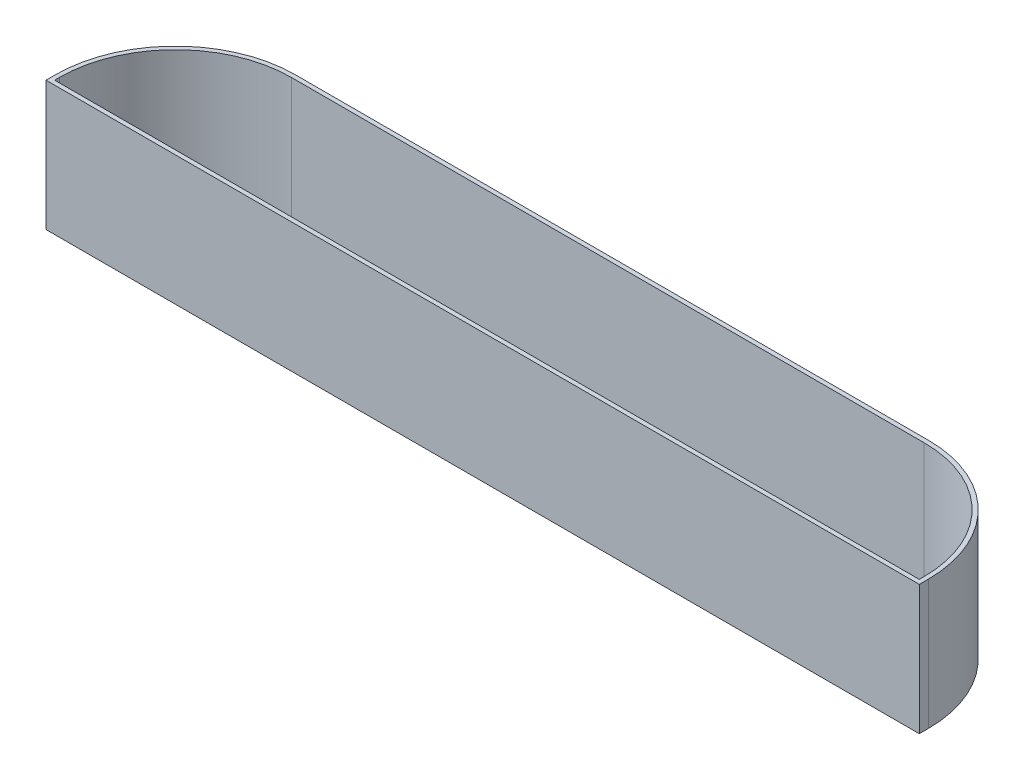
ISO-10303-21;
HEADER;
FILE_DESCRIPTION(('STEP AP214'),'2;1');
FILE_NAME('part.step','',(''),(''),'','','');
FILE_SCHEMA(('AUTOMOTIVE_DESIGN { 1 0 10303 214 1 1 1 1 }'));
ENDSEC;
DATA;
#1=APPLICATION_CONTEXT('core data for automotive mechanical design processes');
#2=APPLICATION_PROTOCOL_DEFINITION('international standard','automotive_design',2000,#1);
#3=PRODUCT_CONTEXT('',#1,'mechanical');
#4=PRODUCT('Part','Part','',(#3));
#5=PRODUCT_RELATED_PRODUCT_CATEGORY('part','',(#4));
#6=PRODUCT_DEFINITION_FORMATION('','',#4);
#7=PRODUCT_DEFINITION_CONTEXT('part definition',#1,'design');
#8=PRODUCT_DEFINITION('design','',#6,#7);
#9=PRODUCT_DEFINITION_SHAPE('','',#8);
#10=(LENGTH_UNIT() NAMED_UNIT(*) SI_UNIT(.MILLI.,.METRE.));
#11=(NAMED_UNIT(*) PLANE_ANGLE_UNIT() SI_UNIT($,.RADIAN.));
#12=(NAMED_UNIT(*) SI_UNIT($,.STERADIAN.) SOLID_ANGLE_UNIT());
#13=UNCERTAINTY_MEASURE_WITH_UNIT(LENGTH_MEASURE(1.E-05),#10,'distance_accuracy_value','');
#14=(GEOMETRIC_REPRESENTATION_CONTEXT(3) GLOBAL_UNCERTAINTY_ASSIGNED_CONTEXT((#13)) GLOBAL_UNIT_ASSIGNED_CONTEXT((#10,
#11,#12)) REPRESENTATION_CONTEXT('',''));
#15=CARTESIAN_POINT('',(0.,0.,0.));
#16=DIRECTION('',(0.,0.,1.));
#17=DIRECTION('',(1.,0.,0.));
#18=AXIS2_PLACEMENT_3D('',#15,#16,#17);
#19=CARTESIAN_POINT('',(-186.375,76.2,-5.40000000000002));
#20=DIRECTION('',(0.,-1.,0.));
#21=DIRECTION('',(0.,0.,-1.));
#22=AXIS2_PLACEMENT_3D('',#19,#20,#21);
#23=PLANE('',#22);
#24=DIRECTION('',(0.,0.,1.));
#25=VECTOR('',#24,1.);
#26=CARTESIAN_POINT('',(-257.175,76.2,0.));
#27=LINE('',#26,#25);
#28=CARTESIAN_POINT('',(-257.175,76.2,-5.3999999999995));
#29=VERTEX_POINT('',#28);
#30=CARTESIAN_POINT('',(-257.175,76.2,0.));
#31=VERTEX_POINT('',#30);
#32=EDGE_CURVE('E181',#29,#31,#27,.T.);
#33=ORIENTED_EDGE('',*,*,#32,.T.);
#34=DIRECTION('',(1.,0.,0.));
#35=VECTOR('',#34,1.);
#36=CARTESIAN_POINT('',(-257.175,76.2,0.));
#37=LINE('',#36,#35);
#38=CARTESIAN_POINT('',(257.175,76.2,0.));
#39=VERTEX_POINT('',#38);
#40=EDGE_CURVE('E184',#31,#39,#37,.T.);
#41=ORIENTED_EDGE('',*,*,#40,.T.);
#42=DIRECTION('',(0.,0.,-1.));
#43=VECTOR('',#42,1.);
#44=CARTESIAN_POINT('',(257.175,76.2,-5.3999999999996));
#45=LINE('',#44,#43);
#46=CARTESIAN_POINT('',(257.175,76.2,-5.3999999999996));
#47=VERTEX_POINT('',#46);
#48=EDGE_CURVE('E187',#39,#47,#45,.T.);
#49=ORIENTED_EDGE('',*,*,#48,.T.);
#50=CARTESIAN_POINT('',(186.375,76.2,-5.4000000000001));
#51=DIRECTION('',(0.,1.,0.));
#52=DIRECTION('',(0.,0.,-1.));
#53=AXIS2_PLACEMENT_3D('',#50,#51,#52);
#54=CIRCLE('',#53,70.8);
#55=CARTESIAN_POINT('',(186.374999999999,76.2,-76.2000000000001));
#56=VERTEX_POINT('',#55);
#57=EDGE_CURVE('E189',#47,#56,#54,.T.);
#58=ORIENTED_EDGE('',*,*,#57,.T.);
#59=DIRECTION('',(-1.,0.,0.));
#60=VECTOR('',#59,1.);
#61=CARTESIAN_POINT('',(-186.375,76.2,-76.2));
#62=LINE('',#61,#60);
#63=CARTESIAN_POINT('',(-186.375,76.2,-76.2));
#64=VERTEX_POINT('',#63);
#65=EDGE_CURVE('E191',#56,#64,#62,.T.);
#66=ORIENTED_EDGE('',*,*,#65,.T.);
#67=CARTESIAN_POINT('',(-186.375,76.2,-5.40000000000002));
#68=DIRECTION('',(0.,1.,0.));
#69=DIRECTION('',(0.,0.,-1.));
#70=AXIS2_PLACEMENT_3D('',#67,#68,#69);
#71=CIRCLE('',#70,70.8);
#72=EDGE_CURVE('E193',#64,#29,#71,.T.);
#73=ORIENTED_EDGE('',*,*,#72,.T.);
#74=EDGE_LOOP('',(#33,#41,#49,#58,#66,#73));
#75=FACE_BOUND('',#74,.T.);
#76=CARTESIAN_POINT('',(186.375,76.2,-5.4000000000001));
#77=DIRECTION('',(0.,1.,0.));
#78=DIRECTION('',(0.,0.,-1.));
#79=AXIS2_PLACEMENT_3D('',#76,#77,#78);
#80=CIRCLE('',#79,68.26);
#81=CARTESIAN_POINT('',(254.635,76.2,-5.40000000000008));
#82=VERTEX_POINT('',#81);
#83=CARTESIAN_POINT('',(186.375,76.2,-73.66));
#84=VERTEX_POINT('',#83);
#85=EDGE_CURVE('E130',#82,#84,#80,.T.);
#86=ORIENTED_EDGE('',*,*,#85,.F.);
#87=DIRECTION('',(0.,0.,-1.));
#88=VECTOR('',#87,1.);
#89=CARTESIAN_POINT('',(254.635,76.2,-5.40000000000008));
#90=LINE('',#89,#88);
#91=CARTESIAN_POINT('',(254.635,76.2,-2.54));
#92=VERTEX_POINT('',#91);
#93=EDGE_CURVE('E159',#92,#82,#90,.T.);
#94=ORIENTED_EDGE('',*,*,#93,.F.);
#95=DIRECTION('',(1.,0.,0.));
#96=VECTOR('',#95,1.);
#97=CARTESIAN_POINT('',(-254.635,76.2,-2.54));
#98=LINE('',#97,#96);
#99=CARTESIAN_POINT('',(-254.635,76.2,-2.54));
#100=VERTEX_POINT('',#99);
#101=EDGE_CURVE('E157',#100,#92,#98,.T.);
#102=ORIENTED_EDGE('',*,*,#101,.F.);
#103=DIRECTION('',(0.,0.,1.));
#104=VECTOR('',#103,1.);
#105=CARTESIAN_POINT('',(-254.635,76.2,-2.54));
#106=LINE('',#105,#104);
#107=CARTESIAN_POINT('',(-254.635,76.2,-5.39999999999998));
#108=VERTEX_POINT('',#107);
#109=EDGE_CURVE('E153',#108,#100,#106,.T.);
#110=ORIENTED_EDGE('',*,*,#109,.F.);
#111=CARTESIAN_POINT('',(-186.375,76.2,-5.40000000000002));
#112=DIRECTION('',(0.,1.,0.));
#113=DIRECTION('',(0.,0.,-1.));
#114=AXIS2_PLACEMENT_3D('',#111,#112,#113);
#115=CIRCLE('',#114,68.26);
#116=CARTESIAN_POINT('',(-186.375,76.2,-73.66));
#117=VERTEX_POINT('',#116);
#118=EDGE_CURVE('E151',#117,#108,#115,.T.);
#119=ORIENTED_EDGE('',*,*,#118,.F.);
#120=DIRECTION('',(-1.,0.,0.));
#121=VECTOR('',#120,1.);
#122=CARTESIAN_POINT('',(-186.375,76.2,-73.66));
#123=LINE('',#122,#121);
#124=EDGE_CURVE('E138',#84,#117,#123,.T.);
#125=ORIENTED_EDGE('',*,*,#124,.F.);
#126=EDGE_LOOP('',(#86,#94,#102,#110,#119,#125));
#127=FACE_BOUND('',#126,.T.);
#128=ADVANCED_FACE('F41',(#75,#127),#23,.F.);
#129=CARTESIAN_POINT('',(-186.375,0.,-5.40000000000002));
#130=DIRECTION('',(0.,-1.,0.));
#131=DIRECTION('',(0.,0.,-1.));
#132=AXIS2_PLACEMENT_3D('',#129,#130,#131);
#133=PLANE('',#132);
#134=DIRECTION('',(0.,0.,1.));
#135=VECTOR('',#134,1.);
#136=CARTESIAN_POINT('',(-257.175,0.,0.));
#137=LINE('',#136,#135);
#138=CARTESIAN_POINT('',(-257.175,0.,-5.3999999999995));
#139=VERTEX_POINT('',#138);
#140=CARTESIAN_POINT('',(-257.175,0.,0.));
#141=VERTEX_POINT('',#140);
#142=EDGE_CURVE('E146',#139,#141,#137,.T.);
#143=ORIENTED_EDGE('',*,*,#142,.F.);
#144=CARTESIAN_POINT('',(-186.375,0.,-5.40000000000002));
#145=DIRECTION('',(0.,1.,0.));
#146=DIRECTION('',(0.,0.,-1.));
#147=AXIS2_PLACEMENT_3D('',#144,#145,#146);
#148=CIRCLE('',#147,70.8);
#149=CARTESIAN_POINT('',(-186.375,0.,-76.2));
#150=VERTEX_POINT('',#149);
#151=EDGE_CURVE('E185',#150,#139,#148,.T.);
#152=ORIENTED_EDGE('',*,*,#151,.F.);
#153=DIRECTION('',(-1.,0.,0.));
#154=VECTOR('',#153,1.);
#155=CARTESIAN_POINT('',(-186.375,0.,-76.2));
#156=LINE('',#155,#154);
#157=CARTESIAN_POINT('',(186.374999999999,0.,-76.2000000000001));
#158=VERTEX_POINT('',#157);
#159=EDGE_CURVE('E204',#158,#150,#156,.T.);
#160=ORIENTED_EDGE('',*,*,#159,.F.);
#161=CARTESIAN_POINT('',(186.375,0.,-5.4000000000001));
#162=DIRECTION('',(0.,1.,0.));
#163=DIRECTION('',(0.,0.,-1.));
#164=AXIS2_PLACEMENT_3D('',#161,#162,#163);
#165=CIRCLE('',#164,70.8);
#166=CARTESIAN_POINT('',(257.175,0.,-5.3999999999996));
#167=VERTEX_POINT('',#166);
#168=EDGE_CURVE('E202',#167,#158,#165,.T.);
#169=ORIENTED_EDGE('',*,*,#168,.F.);
#170=DIRECTION('',(0.,0.,-1.));
#171=VECTOR('',#170,1.);
#172=CARTESIAN_POINT('',(257.175,0.,-5.3999999999996));
#173=LINE('',#172,#171);
#174=CARTESIAN_POINT('',(257.175,0.,0.));
#175=VERTEX_POINT('',#174);
#176=EDGE_CURVE('E200',#175,#167,#173,.T.);
#177=ORIENTED_EDGE('',*,*,#176,.F.);
#178=DIRECTION('',(1.,0.,0.));
#179=VECTOR('',#178,1.);
#180=CARTESIAN_POINT('',(-257.175,0.,0.));
#181=LINE('',#180,#179);
#182=EDGE_CURVE('E198',#141,#175,#181,.T.);
#183=ORIENTED_EDGE('',*,*,#182,.F.);
#184=EDGE_LOOP('',(#143,#152,#160,#169,#177,#183));
#185=FACE_BOUND('',#184,.T.);
#186=DIRECTION('',(0.,0.,-1.));
#187=VECTOR('',#186,1.);
#188=CARTESIAN_POINT('',(254.635,0.,-5.40000000000008));
#189=LINE('',#188,#187);
#190=CARTESIAN_POINT('',(254.635,0.,-2.54));
#191=VERTEX_POINT('',#190);
#192=CARTESIAN_POINT('',(254.635,0.,-5.40000000000008));
#193=VERTEX_POINT('',#192);
#194=EDGE_CURVE('E139',#191,#193,#189,.T.);
#195=ORIENTED_EDGE('',*,*,#194,.T.);
#196=CARTESIAN_POINT('',(186.375,0.,-5.4000000000001));
#197=DIRECTION('',(0.,1.,0.));
#198=DIRECTION('',(0.,0.,-1.));
#199=AXIS2_PLACEMENT_3D('',#196,#197,#198);
#200=CIRCLE('',#199,68.26);
#201=CARTESIAN_POINT('',(186.375,0.,-73.66));
#202=VERTEX_POINT('',#201);
#203=EDGE_CURVE('E64',#193,#202,#200,.T.);
#204=ORIENTED_EDGE('',*,*,#203,.T.);
#205=DIRECTION('',(-1.,0.,0.));
#206=VECTOR('',#205,1.);
#207=CARTESIAN_POINT('',(-186.375,0.,-73.66));
#208=LINE('',#207,#206);
#209=CARTESIAN_POINT('',(-186.375,0.,-73.66));
#210=VERTEX_POINT('',#209);
#211=EDGE_CURVE('E145',#202,#210,#208,.T.);
#212=ORIENTED_EDGE('',*,*,#211,.T.);
#213=CARTESIAN_POINT('',(-186.375,0.,-5.40000000000002));
#214=DIRECTION('',(0.,1.,0.));
#215=DIRECTION('',(0.,0.,-1.));
#216=AXIS2_PLACEMENT_3D('',#213,#214,#215);
#217=CIRCLE('',#216,68.26);
#218=CARTESIAN_POINT('',(-254.635,0.,-5.39999999999998));
#219=VERTEX_POINT('',#218);
#220=EDGE_CURVE('E163',#210,#219,#217,.T.);
#221=ORIENTED_EDGE('',*,*,#220,.T.);
#222=DIRECTION('',(0.,0.,1.));
#223=VECTOR('',#222,1.);
#224=CARTESIAN_POINT('',(-254.635,0.,-2.54));
#225=LINE('',#224,#223);
#226=CARTESIAN_POINT('',(-254.635,0.,-2.54));
#227=VERTEX_POINT('',#226);
#228=EDGE_CURVE('E166',#219,#227,#225,.T.);
#229=ORIENTED_EDGE('',*,*,#228,.T.);
#230=DIRECTION('',(1.,0.,0.));
#231=VECTOR('',#230,1.);
#232=CARTESIAN_POINT('',(-254.635,0.,-2.54));
#233=LINE('',#232,#231);
#234=EDGE_CURVE('E169',#227,#191,#233,.T.);
#235=ORIENTED_EDGE('',*,*,#234,.T.);
#236=EDGE_LOOP('',(#195,#204,#212,#221,#229,#235));
#237=FACE_BOUND('',#236,.T.);
#238=ADVANCED_FACE('F228',(#185,#237),#133,.T.);
#239=CARTESIAN_POINT('',(-257.175,76.2,0.));
#240=DIRECTION('',(1.,0.,0.));
#241=DIRECTION('',(0.,0.,-1.));
#242=AXIS2_PLACEMENT_3D('',#239,#240,#241);
#243=PLANE('',#242);
#244=ORIENTED_EDGE('',*,*,#142,.T.);
#245=DIRECTION('',(0.,-1.,0.));
#246=VECTOR('',#245,1.);
#247=CARTESIAN_POINT('',(-257.175,76.2,0.));
#248=LINE('',#247,#246);
#249=EDGE_CURVE('E11',#31,#141,#248,.T.);
#250=ORIENTED_EDGE('',*,*,#249,.F.);
#251=ORIENTED_EDGE('',*,*,#32,.F.);
#252=DIRECTION('',(0.,-1.,0.));
#253=VECTOR('',#252,1.);
#254=CARTESIAN_POINT('',(-257.175,76.2,-5.3999999999995));
#255=LINE('',#254,#253);
#256=EDGE_CURVE('E195',#29,#139,#255,.T.);
#257=ORIENTED_EDGE('',*,*,#256,.T.);
#258=EDGE_LOOP('',(#244,#250,#251,#257));
#259=FACE_BOUND('',#258,.T.);
#260=ADVANCED_FACE('F43',(#259),#243,.F.);
#261=CARTESIAN_POINT('',(-257.175,76.2,0.));
#262=DIRECTION('',(0.,0.,-1.));
#263=DIRECTION('',(-1.,0.,0.));
#264=AXIS2_PLACEMENT_3D('',#261,#262,#263);
#265=PLANE('',#264);
#266=ORIENTED_EDGE('',*,*,#182,.T.);
#267=DIRECTION('',(0.,-1.,0.));
#268=VECTOR('',#267,1.);
#269=CARTESIAN_POINT('',(257.175,76.2,0.));
#270=LINE('',#269,#268);
#271=EDGE_CURVE('E49',#39,#175,#270,.T.);
#272=ORIENTED_EDGE('',*,*,#271,.F.);
#273=ORIENTED_EDGE('',*,*,#40,.F.);
#274=ORIENTED_EDGE('',*,*,#249,.T.);
#275=EDGE_LOOP('',(#266,#272,#273,#274));
#276=FACE_BOUND('',#275,.T.);
#277=ADVANCED_FACE('F245',(#276),#265,.F.);
#278=CARTESIAN_POINT('',(257.175,76.2,-5.3999999999996));
#279=DIRECTION('',(-1.,0.,0.));
#280=DIRECTION('',(0.,0.,1.));
#281=AXIS2_PLACEMENT_3D('',#278,#279,#280);
#282=PLANE('',#281);
#283=ORIENTED_EDGE('',*,*,#176,.T.);
#284=DIRECTION('',(0.,-1.,0.));
#285=VECTOR('',#284,1.);
#286=CARTESIAN_POINT('',(257.175,76.2,-5.3999999999996));
#287=LINE('',#286,#285);
#288=EDGE_CURVE('E215',#47,#167,#287,.T.);
#289=ORIENTED_EDGE('',*,*,#288,.F.);
#290=ORIENTED_EDGE('',*,*,#48,.F.);
#291=ORIENTED_EDGE('',*,*,#271,.T.);
#292=EDGE_LOOP('',(#283,#289,#290,#291));
#293=FACE_BOUND('',#292,.T.);
#294=ADVANCED_FACE('F222',(#293),#282,.F.);
#295=CARTESIAN_POINT('',(186.375,76.2,-5.4000000000001));
#296=DIRECTION('',(0.,-1.,0.));
#297=DIRECTION('',(0.,0.,-1.));
#298=AXIS2_PLACEMENT_3D('',#295,#296,#297);
#299=CYLINDRICAL_SURFACE('',#298,70.8);
#300=ORIENTED_EDGE('',*,*,#168,.T.);
#301=DIRECTION('',(0.,-1.,0.));
#302=VECTOR('',#301,1.);
#303=CARTESIAN_POINT('',(186.374999999999,76.2,-76.2000000000001));
#304=LINE('',#303,#302);
#305=EDGE_CURVE('E212',#56,#158,#304,.T.);
#306=ORIENTED_EDGE('',*,*,#305,.F.);
#307=ORIENTED_EDGE('',*,*,#57,.F.);
#308=ORIENTED_EDGE('',*,*,#288,.T.);
#309=EDGE_LOOP('',(#300,#306,#307,#308));
#310=FACE_BOUND('',#309,.T.);
#311=ADVANCED_FACE('F234',(#310),#299,.T.);
#312=CARTESIAN_POINT('',(-186.375,76.2,-76.2));
#313=DIRECTION('',(0.,0.,1.));
#314=DIRECTION('',(1.,0.,0.));
#315=AXIS2_PLACEMENT_3D('',#312,#313,#314);
#316=PLANE('',#315);
#317=ORIENTED_EDGE('',*,*,#159,.T.);
#318=DIRECTION('',(0.,-1.,0.));
#319=VECTOR('',#318,1.);
#320=CARTESIAN_POINT('',(-186.375,76.2,-76.2));
#321=LINE('',#320,#319);
#322=EDGE_CURVE('E209',#64,#150,#321,.T.);
#323=ORIENTED_EDGE('',*,*,#322,.F.);
#324=ORIENTED_EDGE('',*,*,#65,.F.);
#325=ORIENTED_EDGE('',*,*,#305,.T.);
#326=EDGE_LOOP('',(#317,#323,#324,#325));
#327=FACE_BOUND('',#326,.T.);
#328=ADVANCED_FACE('F238',(#327),#316,.F.);
#329=CARTESIAN_POINT('',(-186.375,76.2,-5.40000000000002));
#330=DIRECTION('',(0.,-1.,0.));
#331=DIRECTION('',(0.,0.,-1.));
#332=AXIS2_PLACEMENT_3D('',#329,#330,#331);
#333=CYLINDRICAL_SURFACE('',#332,70.8);
#334=ORIENTED_EDGE('',*,*,#151,.T.);
#335=ORIENTED_EDGE('',*,*,#256,.F.);
#336=ORIENTED_EDGE('',*,*,#72,.F.);
#337=ORIENTED_EDGE('',*,*,#322,.T.);
#338=EDGE_LOOP('',(#334,#335,#336,#337));
#339=FACE_BOUND('',#338,.T.);
#340=ADVANCED_FACE('F248',(#339),#333,.T.);
#341=CARTESIAN_POINT('',(186.375,76.2,-5.4000000000001));
#342=DIRECTION('',(0.,-1.,0.));
#343=DIRECTION('',(0.,0.,-1.));
#344=AXIS2_PLACEMENT_3D('',#341,#342,#343);
#345=CYLINDRICAL_SURFACE('',#344,68.26);
#346=ORIENTED_EDGE('',*,*,#203,.F.);
#347=DIRECTION('',(0.,-1.,0.));
#348=VECTOR('',#347,1.);
#349=CARTESIAN_POINT('',(254.635,76.2,-5.40000000000008));
#350=LINE('',#349,#348);
#351=EDGE_CURVE('E134',#82,#193,#350,.T.);
#352=ORIENTED_EDGE('',*,*,#351,.F.);
#353=ORIENTED_EDGE('',*,*,#85,.T.);
#354=DIRECTION('',(0.,-1.,0.));
#355=VECTOR('',#354,1.);
#356=CARTESIAN_POINT('',(186.375,76.2,-73.66));
#357=LINE('',#356,#355);
#358=EDGE_CURVE('E133',#84,#202,#357,.T.);
#359=ORIENTED_EDGE('',*,*,#358,.T.);
#360=EDGE_LOOP('',(#346,#352,#353,#359));
#361=FACE_BOUND('',#360,.T.);
#362=ADVANCED_FACE('F132',(#361),#345,.F.);
#363=CARTESIAN_POINT('',(-186.375,76.2,-73.66));
#364=DIRECTION('',(0.,0.,1.));
#365=DIRECTION('',(1.,0.,0.));
#366=AXIS2_PLACEMENT_3D('',#363,#364,#365);
#367=PLANE('',#366);
#368=ORIENTED_EDGE('',*,*,#211,.F.);
#369=ORIENTED_EDGE('',*,*,#358,.F.);
#370=ORIENTED_EDGE('',*,*,#124,.T.);
#371=DIRECTION('',(0.,-1.,0.));
#372=VECTOR('',#371,1.);
#373=CARTESIAN_POINT('',(-186.375,76.2,-73.66));
#374=LINE('',#373,#372);
#375=EDGE_CURVE('E147',#117,#210,#374,.T.);
#376=ORIENTED_EDGE('',*,*,#375,.T.);
#377=EDGE_LOOP('',(#368,#369,#370,#376));
#378=FACE_BOUND('',#377,.T.);
#379=ADVANCED_FACE('F142',(#378),#367,.T.);
#380=CARTESIAN_POINT('',(-186.375,76.2,-5.40000000000002));
#381=DIRECTION('',(0.,-1.,0.));
#382=DIRECTION('',(0.,0.,-1.));
#383=AXIS2_PLACEMENT_3D('',#380,#381,#382);
#384=CYLINDRICAL_SURFACE('',#383,68.26);
#385=ORIENTED_EDGE('',*,*,#220,.F.);
#386=ORIENTED_EDGE('',*,*,#375,.F.);
#387=ORIENTED_EDGE('',*,*,#118,.T.);
#388=DIRECTION('',(0.,-1.,0.));
#389=VECTOR('',#388,1.);
#390=CARTESIAN_POINT('',(-254.635,76.2,-5.39999999999998));
#391=LINE('',#390,#389);
#392=EDGE_CURVE('E178',#108,#219,#391,.T.);
#393=ORIENTED_EDGE('',*,*,#392,.T.);
#394=EDGE_LOOP('',(#385,#386,#387,#393));
#395=FACE_BOUND('',#394,.T.);
#396=ADVANCED_FACE('F266',(#395),#384,.F.);
#397=CARTESIAN_POINT('',(-254.635,76.2,-2.54));
#398=DIRECTION('',(1.,0.,0.));
#399=DIRECTION('',(0.,0.,-1.));
#400=AXIS2_PLACEMENT_3D('',#397,#398,#399);
#401=PLANE('',#400);
#402=ORIENTED_EDGE('',*,*,#228,.F.);
#403=ORIENTED_EDGE('',*,*,#392,.F.);
#404=ORIENTED_EDGE('',*,*,#109,.T.);
#405=DIRECTION('',(0.,-1.,0.));
#406=VECTOR('',#405,1.);
#407=CARTESIAN_POINT('',(-254.635,76.2,-2.54));
#408=LINE('',#407,#406);
#409=EDGE_CURVE('E176',#100,#227,#408,.T.);
#410=ORIENTED_EDGE('',*,*,#409,.T.);
#411=EDGE_LOOP('',(#402,#403,#404,#410));
#412=FACE_BOUND('',#411,.T.);
#413=ADVANCED_FACE('F269',(#412),#401,.T.);
#414=CARTESIAN_POINT('',(-254.635,76.2,-2.54));
#415=DIRECTION('',(0.,0.,-1.));
#416=DIRECTION('',(-1.,0.,0.));
#417=AXIS2_PLACEMENT_3D('',#414,#415,#416);
#418=PLANE('',#417);
#419=ORIENTED_EDGE('',*,*,#234,.F.);
#420=ORIENTED_EDGE('',*,*,#409,.F.);
#421=ORIENTED_EDGE('',*,*,#101,.T.);
#422=DIRECTION('',(0.,-1.,0.));
#423=VECTOR('',#422,1.);
#424=CARTESIAN_POINT('',(254.635,76.2,-2.54));
#425=LINE('',#424,#423);
#426=EDGE_CURVE('E56',#92,#191,#425,.T.);
#427=ORIENTED_EDGE('',*,*,#426,.T.);
#428=EDGE_LOOP('',(#419,#420,#421,#427));
#429=FACE_BOUND('',#428,.T.);
#430=ADVANCED_FACE('F273',(#429),#418,.T.);
#431=CARTESIAN_POINT('',(254.635,76.2,-5.40000000000008));
#432=DIRECTION('',(-1.,0.,0.));
#433=DIRECTION('',(0.,0.,1.));
#434=AXIS2_PLACEMENT_3D('',#431,#432,#433);
#435=PLANE('',#434);
#436=ORIENTED_EDGE('',*,*,#194,.F.);
#437=ORIENTED_EDGE('',*,*,#426,.F.);
#438=ORIENTED_EDGE('',*,*,#93,.T.);
#439=ORIENTED_EDGE('',*,*,#351,.T.);
#440=EDGE_LOOP('',(#436,#437,#438,#439));
#441=FACE_BOUND('',#440,.T.);
#442=ADVANCED_FACE('F277',(#441),#435,.T.);
#443=CLOSED_SHELL('',(#128,#238,#260,#277,#294,#311,#328,#340,#362,#379,#396,#413,#430,#442));
#444=MANIFOLD_SOLID_BREP('B2',#443);
#445=ADVANCED_BREP_SHAPE_REPRESENTATION('',(#18,#444),#14);
#446=SHAPE_DEFINITION_REPRESENTATION(#9,#445);
ENDSEC;
END-ISO-10303-21;
